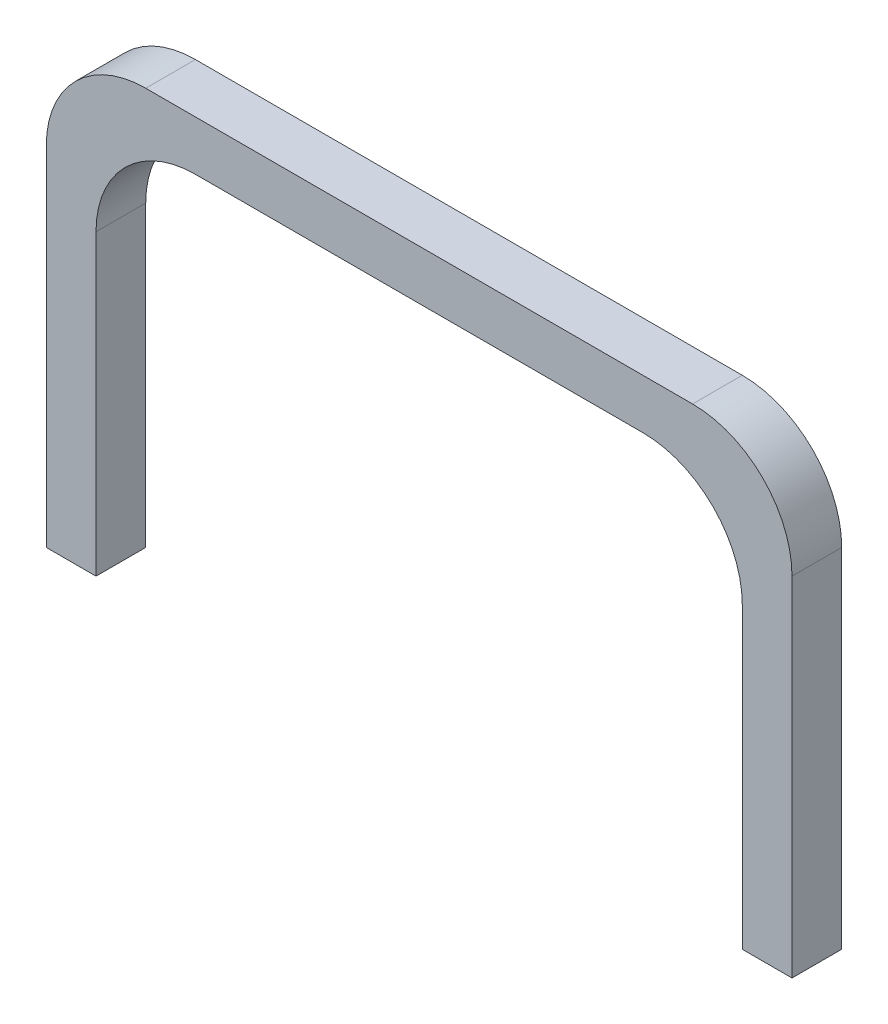
ISO-10303-21;
HEADER;
FILE_DESCRIPTION(('STEP AP214'),'2;1');
FILE_NAME('part.step','',(''),(''),'','','');
FILE_SCHEMA(('AUTOMOTIVE_DESIGN { 1 0 10303 214 1 1 1 1 }'));
ENDSEC;
DATA;
#1=APPLICATION_CONTEXT('core data for automotive mechanical design processes');
#2=APPLICATION_PROTOCOL_DEFINITION('international standard','automotive_design',2000,#1);
#3=PRODUCT_CONTEXT('',#1,'mechanical');
#4=PRODUCT('Part','Part','',(#3));
#5=PRODUCT_RELATED_PRODUCT_CATEGORY('part','',(#4));
#6=PRODUCT_DEFINITION_FORMATION('','',#4);
#7=PRODUCT_DEFINITION_CONTEXT('part definition',#1,'design');
#8=PRODUCT_DEFINITION('design','',#6,#7);
#9=PRODUCT_DEFINITION_SHAPE('','',#8);
#10=(LENGTH_UNIT() NAMED_UNIT(*) SI_UNIT(.MILLI.,.METRE.));
#11=(NAMED_UNIT(*) PLANE_ANGLE_UNIT() SI_UNIT($,.RADIAN.));
#12=(NAMED_UNIT(*) SI_UNIT($,.STERADIAN.) SOLID_ANGLE_UNIT());
#13=UNCERTAINTY_MEASURE_WITH_UNIT(LENGTH_MEASURE(1.E-05),#10,'distance_accuracy_value','');
#14=(GEOMETRIC_REPRESENTATION_CONTEXT(3) GLOBAL_UNCERTAINTY_ASSIGNED_CONTEXT((#13)) GLOBAL_UNIT_ASSIGNED_CONTEXT((#10,
#11,#12)) REPRESENTATION_CONTEXT('',''));
#15=CARTESIAN_POINT('',(0.,0.,0.));
#16=DIRECTION('',(0.,0.,1.));
#17=DIRECTION('',(1.,0.,0.));
#18=AXIS2_PLACEMENT_3D('',#15,#16,#17);
#19=CARTESIAN_POINT('',(0.,-0.5,0.));
#20=DIRECTION('',(0.,1.,0.));
#21=DIRECTION('',(0.,0.,1.));
#22=AXIS2_PLACEMENT_3D('',#19,#20,#21);
#23=PLANE('',#22);
#24=DIRECTION('',(-1.,0.,0.));
#25=VECTOR('',#24,1.);
#26=CARTESIAN_POINT('',(-7.5,-0.5,-0.5));
#27=LINE('',#26,#25);
#28=CARTESIAN_POINT('',(4.5,-0.5,-0.5));
#29=VERTEX_POINT('',#28);
#30=CARTESIAN_POINT('',(-4.5,-0.5,-0.5));
#31=VERTEX_POINT('',#30);
#32=EDGE_CURVE('E167',#29,#31,#27,.T.);
#33=ORIENTED_EDGE('',*,*,#32,.F.);
#34=DIRECTION('',(0.,0.,-1.));
#35=VECTOR('',#34,1.);
#36=CARTESIAN_POINT('',(4.5,-0.5,0.500000000000002));
#37=LINE('',#36,#35);
#38=CARTESIAN_POINT('',(4.5,-0.5,0.5));
#39=VERTEX_POINT('',#38);
#40=EDGE_CURVE('E58',#29,#39,#37,.F.);
#41=ORIENTED_EDGE('',*,*,#40,.T.);
#42=DIRECTION('',(1.,0.,0.));
#43=VECTOR('',#42,1.);
#44=CARTESIAN_POINT('',(-7.5,-0.5,0.5));
#45=LINE('',#44,#43);
#46=CARTESIAN_POINT('',(-4.5,-0.5,0.5));
#47=VERTEX_POINT('',#46);
#48=EDGE_CURVE('E172',#47,#39,#45,.T.);
#49=ORIENTED_EDGE('',*,*,#48,.F.);
#50=DIRECTION('',(0.,0.,1.));
#51=VECTOR('',#50,1.);
#52=CARTESIAN_POINT('',(-4.5,-0.5,-0.5));
#53=LINE('',#52,#51);
#54=EDGE_CURVE('E206',#47,#31,#53,.F.);
#55=ORIENTED_EDGE('',*,*,#54,.T.);
#56=EDGE_LOOP('',(#33,#41,#49,#55));
#57=FACE_BOUND('',#56,.T.);
#58=ADVANCED_FACE('F35',(#57),#23,.F.);
#59=CARTESIAN_POINT('',(7.5,0.5,-0.5));
#60=DIRECTION('',(-1.,0.,0.));
#61=DIRECTION('',(0.,0.,1.));
#62=AXIS2_PLACEMENT_3D('',#59,#60,#61);
#63=PLANE('',#62);
#64=DIRECTION('',(0.,-1.,0.));
#65=VECTOR('',#64,1.);
#66=CARTESIAN_POINT('',(7.5,0.5,-0.5));
#67=LINE('',#66,#65);
#68=CARTESIAN_POINT('',(7.5,-1.5,-0.5));
#69=VERTEX_POINT('',#68);
#70=CARTESIAN_POINT('',(7.5,-8.5,-0.499999999999998));
#71=VERTEX_POINT('',#70);
#72=EDGE_CURVE('E184',#69,#71,#67,.T.);
#73=ORIENTED_EDGE('',*,*,#72,.F.);
#74=DIRECTION('',(0.,0.,-1.));
#75=VECTOR('',#74,1.);
#76=CARTESIAN_POINT('',(7.5,-1.5,0.5));
#77=LINE('',#76,#75);
#78=CARTESIAN_POINT('',(7.5,-1.5,0.5));
#79=VERTEX_POINT('',#78);
#80=EDGE_CURVE('E196',#69,#79,#77,.F.);
#81=ORIENTED_EDGE('',*,*,#80,.T.);
#82=DIRECTION('',(0.,-1.,0.));
#83=VECTOR('',#82,1.);
#84=CARTESIAN_POINT('',(7.5,0.5,0.5));
#85=LINE('',#84,#83);
#86=CARTESIAN_POINT('',(7.5,-8.5,0.500000000000002));
#87=VERTEX_POINT('',#86);
#88=EDGE_CURVE('E175',#79,#87,#85,.T.);
#89=ORIENTED_EDGE('',*,*,#88,.T.);
#90=DIRECTION('',(0.,0.,1.));
#91=VECTOR('',#90,1.);
#92=CARTESIAN_POINT('',(7.5,-8.5,0.500000000000002));
#93=LINE('',#92,#91);
#94=EDGE_CURVE('E143',#71,#87,#93,.T.);
#95=ORIENTED_EDGE('',*,*,#94,.F.);
#96=EDGE_LOOP('',(#73,#81,#89,#95));
#97=FACE_BOUND('',#96,.T.);
#98=ADVANCED_FACE('F249',(#97),#63,.F.);
#99=CARTESIAN_POINT('',(-7.5,0.5,-0.5));
#100=DIRECTION('',(0.,0.,1.));
#101=DIRECTION('',(1.,0.,0.));
#102=AXIS2_PLACEMENT_3D('',#99,#100,#101);
#103=PLANE('',#102);
#104=DIRECTION('',(-1.,0.,0.));
#105=VECTOR('',#104,1.);
#106=CARTESIAN_POINT('',(-7.5,0.5,-0.5));
#107=LINE('',#106,#105);
#108=CARTESIAN_POINT('',(5.5,0.5,-0.5));
#109=VERTEX_POINT('',#108);
#110=CARTESIAN_POINT('',(-5.5,0.5,-0.5));
#111=VERTEX_POINT('',#110);
#112=EDGE_CURVE('E168',#109,#111,#107,.T.);
#113=ORIENTED_EDGE('',*,*,#112,.F.);
#114=CARTESIAN_POINT('',(5.5,-1.5,-0.5));
#115=DIRECTION('',(0.,0.,1.));
#116=DIRECTION('',(1.,0.,0.));
#117=AXIS2_PLACEMENT_3D('',#114,#115,#116);
#118=CIRCLE('',#117,2.);
#119=EDGE_CURVE('E194',#109,#69,#118,.F.);
#120=ORIENTED_EDGE('',*,*,#119,.T.);
#121=ORIENTED_EDGE('',*,*,#72,.T.);
#122=DIRECTION('',(1.,0.,0.));
#123=VECTOR('',#122,1.);
#124=CARTESIAN_POINT('',(7.5,-8.5,-0.499999999999998));
#125=LINE('',#124,#123);
#126=CARTESIAN_POINT('',(6.5,-8.5,-0.499999999999998));
#127=VERTEX_POINT('',#126);
#128=EDGE_CURVE('E136',#127,#71,#125,.T.);
#129=ORIENTED_EDGE('',*,*,#128,.F.);
#130=DIRECTION('',(0.,1.,0.));
#131=VECTOR('',#130,1.);
#132=CARTESIAN_POINT('',(6.5,-8.5,-0.499999999999998));
#133=LINE('',#132,#131);
#134=CARTESIAN_POINT('',(6.5,-2.5,-0.499999999999998));
#135=VERTEX_POINT('',#134);
#136=EDGE_CURVE('E132',#127,#135,#133,.T.);
#137=ORIENTED_EDGE('',*,*,#136,.T.);
#138=CARTESIAN_POINT('',(4.5,-2.5,-0.5));
#139=DIRECTION('',(0.,0.,1.));
#140=DIRECTION('',(1.,0.,0.));
#141=AXIS2_PLACEMENT_3D('',#138,#139,#140);
#142=CIRCLE('',#141,2.);
#143=EDGE_CURVE('E212',#135,#29,#142,.T.);
#144=ORIENTED_EDGE('',*,*,#143,.T.);
#145=ORIENTED_EDGE('',*,*,#32,.T.);
#146=CARTESIAN_POINT('',(-4.5,-2.5,-0.5));
#147=DIRECTION('',(0.,0.,1.));
#148=DIRECTION('',(1.,0.,0.));
#149=AXIS2_PLACEMENT_3D('',#146,#147,#148);
#150=CIRCLE('',#149,2.);
#151=CARTESIAN_POINT('',(-6.5,-2.5,-0.5));
#152=VERTEX_POINT('',#151);
#153=EDGE_CURVE('E11',#31,#152,#150,.T.);
#154=ORIENTED_EDGE('',*,*,#153,.T.);
#155=DIRECTION('',(0.,1.,0.));
#156=VECTOR('',#155,1.);
#157=CARTESIAN_POINT('',(-6.5,-8.5,-0.5));
#158=LINE('',#157,#156);
#159=CARTESIAN_POINT('',(-6.5,-8.5,-0.5));
#160=VERTEX_POINT('',#159);
#161=EDGE_CURVE('E164',#160,#152,#158,.T.);
#162=ORIENTED_EDGE('',*,*,#161,.F.);
#163=DIRECTION('',(1.,0.,0.));
#164=VECTOR('',#163,1.);
#165=CARTESIAN_POINT('',(-7.5,-8.5,-0.5));
#166=LINE('',#165,#164);
#167=CARTESIAN_POINT('',(-7.5,-8.5,-0.5));
#168=VERTEX_POINT('',#167);
#169=EDGE_CURVE('E150',#168,#160,#166,.T.);
#170=ORIENTED_EDGE('',*,*,#169,.F.);
#171=DIRECTION('',(0.,-1.,0.));
#172=VECTOR('',#171,1.);
#173=CARTESIAN_POINT('',(-7.5,0.5,-0.5));
#174=LINE('',#173,#172);
#175=CARTESIAN_POINT('',(-7.5,-1.5,-0.5));
#176=VERTEX_POINT('',#175);
#177=EDGE_CURVE('E182',#176,#168,#174,.T.);
#178=ORIENTED_EDGE('',*,*,#177,.F.);
#179=CARTESIAN_POINT('',(-5.5,-1.5,-0.5));
#180=DIRECTION('',(0.,0.,1.));
#181=DIRECTION('',(1.,0.,0.));
#182=AXIS2_PLACEMENT_3D('',#179,#180,#181);
#183=CIRCLE('',#182,2.);
#184=EDGE_CURVE('E192',#176,#111,#183,.F.);
#185=ORIENTED_EDGE('',*,*,#184,.T.);
#186=EDGE_LOOP('',(#113,#120,#121,#129,#137,#144,#145,#154,#162,#170,#178,#185));
#187=FACE_BOUND('',#186,.T.);
#188=ADVANCED_FACE('F223',(#187),#103,.F.);
#189=CARTESIAN_POINT('',(-7.5,0.5,-0.5));
#190=DIRECTION('',(1.,0.,0.));
#191=DIRECTION('',(0.,0.,-1.));
#192=AXIS2_PLACEMENT_3D('',#189,#190,#191);
#193=PLANE('',#192);
#194=DIRECTION('',(0.,-1.,0.));
#195=VECTOR('',#194,1.);
#196=CARTESIAN_POINT('',(-7.5,0.5,0.5));
#197=LINE('',#196,#195);
#198=CARTESIAN_POINT('',(-7.5,-1.5,0.5));
#199=VERTEX_POINT('',#198);
#200=CARTESIAN_POINT('',(-7.5,-8.5,0.5));
#201=VERTEX_POINT('',#200);
#202=EDGE_CURVE('E180',#199,#201,#197,.T.);
#203=ORIENTED_EDGE('',*,*,#202,.F.);
#204=DIRECTION('',(0.,0.,1.));
#205=VECTOR('',#204,1.);
#206=CARTESIAN_POINT('',(-7.5,-1.5,-0.5));
#207=LINE('',#206,#205);
#208=EDGE_CURVE('E202',#199,#176,#207,.F.);
#209=ORIENTED_EDGE('',*,*,#208,.T.);
#210=ORIENTED_EDGE('',*,*,#177,.T.);
#211=DIRECTION('',(0.,0.,-1.));
#212=VECTOR('',#211,1.);
#213=CARTESIAN_POINT('',(-7.5,-8.5,0.5));
#214=LINE('',#213,#212);
#215=EDGE_CURVE('E147',#201,#168,#214,.T.);
#216=ORIENTED_EDGE('',*,*,#215,.F.);
#217=EDGE_LOOP('',(#203,#209,#210,#216));
#218=FACE_BOUND('',#217,.T.);
#219=ADVANCED_FACE('F270',(#218),#193,.F.);
#220=CARTESIAN_POINT('',(-7.5,0.5,0.5));
#221=DIRECTION('',(0.,0.,-1.));
#222=DIRECTION('',(-1.,0.,0.));
#223=AXIS2_PLACEMENT_3D('',#220,#221,#222);
#224=PLANE('',#223);
#225=ORIENTED_EDGE('',*,*,#88,.F.);
#226=CARTESIAN_POINT('',(5.5,-1.5,0.5));
#227=DIRECTION('',(0.,0.,-1.));
#228=DIRECTION('',(-1.,0.,0.));
#229=AXIS2_PLACEMENT_3D('',#226,#227,#228);
#230=CIRCLE('',#229,2.);
#231=CARTESIAN_POINT('',(5.5,0.5,0.5));
#232=VERTEX_POINT('',#231);
#233=EDGE_CURVE('E200',#79,#232,#230,.F.);
#234=ORIENTED_EDGE('',*,*,#233,.T.);
#235=DIRECTION('',(1.,0.,0.));
#236=VECTOR('',#235,1.);
#237=CARTESIAN_POINT('',(-7.5,0.5,0.5));
#238=LINE('',#237,#236);
#239=CARTESIAN_POINT('',(-5.5,0.5,0.5));
#240=VERTEX_POINT('',#239);
#241=EDGE_CURVE('E171',#240,#232,#238,.T.);
#242=ORIENTED_EDGE('',*,*,#241,.F.);
#243=CARTESIAN_POINT('',(-5.5,-1.5,0.5));
#244=DIRECTION('',(0.,0.,-1.));
#245=DIRECTION('',(-1.,0.,0.));
#246=AXIS2_PLACEMENT_3D('',#243,#244,#245);
#247=CIRCLE('',#246,2.);
#248=EDGE_CURVE('E198',#240,#199,#247,.F.);
#249=ORIENTED_EDGE('',*,*,#248,.T.);
#250=ORIENTED_EDGE('',*,*,#202,.T.);
#251=DIRECTION('',(-1.,0.,0.));
#252=VECTOR('',#251,1.);
#253=CARTESIAN_POINT('',(-7.5,-8.5,0.5));
#254=LINE('',#253,#252);
#255=CARTESIAN_POINT('',(-6.5,-8.5,0.5));
#256=VERTEX_POINT('',#255);
#257=EDGE_CURVE('E158',#256,#201,#254,.T.);
#258=ORIENTED_EDGE('',*,*,#257,.F.);
#259=DIRECTION('',(0.,1.,0.));
#260=VECTOR('',#259,1.);
#261=CARTESIAN_POINT('',(-6.5,-8.5,0.5));
#262=LINE('',#261,#260);
#263=CARTESIAN_POINT('',(-6.5,-2.5,0.5));
#264=VERTEX_POINT('',#263);
#265=EDGE_CURVE('E161',#256,#264,#262,.T.);
#266=ORIENTED_EDGE('',*,*,#265,.T.);
#267=CARTESIAN_POINT('',(-4.5,-2.5,0.5));
#268=DIRECTION('',(0.,0.,-1.));
#269=DIRECTION('',(-1.,0.,0.));
#270=AXIS2_PLACEMENT_3D('',#267,#268,#269);
#271=CIRCLE('',#270,2.);
#272=EDGE_CURVE('E43',#264,#47,#271,.T.);
#273=ORIENTED_EDGE('',*,*,#272,.T.);
#274=ORIENTED_EDGE('',*,*,#48,.T.);
#275=CARTESIAN_POINT('',(4.5,-2.5,0.5));
#276=DIRECTION('',(0.,0.,-1.));
#277=DIRECTION('',(-1.,0.,0.));
#278=AXIS2_PLACEMENT_3D('',#275,#276,#277);
#279=CIRCLE('',#278,2.);
#280=CARTESIAN_POINT('',(6.5,-2.5,0.500000000000002));
#281=VERTEX_POINT('',#280);
#282=EDGE_CURVE('E50',#39,#281,#279,.T.);
#283=ORIENTED_EDGE('',*,*,#282,.T.);
#284=DIRECTION('',(0.,1.,0.));
#285=VECTOR('',#284,1.);
#286=CARTESIAN_POINT('',(6.5,-8.5,0.500000000000002));
#287=LINE('',#286,#285);
#288=CARTESIAN_POINT('',(6.5,-8.5,0.500000000000002));
#289=VERTEX_POINT('',#288);
#290=EDGE_CURVE('E129',#289,#281,#287,.T.);
#291=ORIENTED_EDGE('',*,*,#290,.F.);
#292=DIRECTION('',(-1.,0.,0.));
#293=VECTOR('',#292,1.);
#294=CARTESIAN_POINT('',(7.5,-8.5,0.500000000000002));
#295=LINE('',#294,#293);
#296=EDGE_CURVE('E137',#87,#289,#295,.T.);
#297=ORIENTED_EDGE('',*,*,#296,.F.);
#298=EDGE_LOOP('',(#225,#234,#242,#249,#250,#258,#266,#273,#274,#283,#291,#297));
#299=FACE_BOUND('',#298,.T.);
#300=ADVANCED_FACE('F146',(#299),#224,.F.);
#301=CARTESIAN_POINT('',(0.,0.5,0.));
#302=DIRECTION('',(0.,1.,0.));
#303=DIRECTION('',(0.,0.,1.));
#304=AXIS2_PLACEMENT_3D('',#301,#302,#303);
#305=PLANE('',#304);
#306=ORIENTED_EDGE('',*,*,#241,.T.);
#307=DIRECTION('',(0.,0.,-1.));
#308=VECTOR('',#307,1.);
#309=CARTESIAN_POINT('',(5.5,0.5,-0.5));
#310=LINE('',#309,#308);
#311=EDGE_CURVE('E189',#232,#109,#310,.T.);
#312=ORIENTED_EDGE('',*,*,#311,.T.);
#313=ORIENTED_EDGE('',*,*,#112,.T.);
#314=DIRECTION('',(0.,0.,1.));
#315=VECTOR('',#314,1.);
#316=CARTESIAN_POINT('',(-5.5,0.5,0.5));
#317=LINE('',#316,#315);
#318=EDGE_CURVE('E186',#111,#240,#317,.T.);
#319=ORIENTED_EDGE('',*,*,#318,.T.);
#320=EDGE_LOOP('',(#306,#312,#313,#319));
#321=FACE_BOUND('',#320,.T.);
#322=ADVANCED_FACE('F240',(#321),#305,.T.);
#323=CARTESIAN_POINT('',(-6.5,-8.5,0.5));
#324=DIRECTION('',(-1.,0.,0.));
#325=DIRECTION('',(0.,0.,1.));
#326=AXIS2_PLACEMENT_3D('',#323,#324,#325);
#327=PLANE('',#326);
#328=ORIENTED_EDGE('',*,*,#161,.T.);
#329=DIRECTION('',(0.,0.,1.));
#330=VECTOR('',#329,1.);
#331=CARTESIAN_POINT('',(-6.5,-2.5,0.5));
#332=LINE('',#331,#330);
#333=EDGE_CURVE('E209',#152,#264,#332,.T.);
#334=ORIENTED_EDGE('',*,*,#333,.T.);
#335=ORIENTED_EDGE('',*,*,#265,.F.);
#336=DIRECTION('',(0.,0.,1.));
#337=VECTOR('',#336,1.);
#338=CARTESIAN_POINT('',(-6.5,-8.5,0.5));
#339=LINE('',#338,#337);
#340=EDGE_CURVE('E156',#160,#256,#339,.T.);
#341=ORIENTED_EDGE('',*,*,#340,.F.);
#342=EDGE_LOOP('',(#328,#334,#335,#341));
#343=FACE_BOUND('',#342,.T.);
#344=ADVANCED_FACE('F227',(#343),#327,.F.);
#345=CARTESIAN_POINT('',(0.,-8.5,0.));
#346=DIRECTION('',(0.,-1.,0.));
#347=DIRECTION('',(0.,0.,-1.));
#348=AXIS2_PLACEMENT_3D('',#345,#346,#347);
#349=PLANE('',#348);
#350=ORIENTED_EDGE('',*,*,#215,.T.);
#351=ORIENTED_EDGE('',*,*,#169,.T.);
#352=ORIENTED_EDGE('',*,*,#340,.T.);
#353=ORIENTED_EDGE('',*,*,#257,.T.);
#354=EDGE_LOOP('',(#350,#351,#352,#353));
#355=FACE_BOUND('',#354,.T.);
#356=ADVANCED_FACE('F229',(#355),#349,.T.);
#357=CARTESIAN_POINT('',(6.5,-8.5,0.500000000000002));
#358=DIRECTION('',(1.,0.,0.));
#359=DIRECTION('',(0.,0.,-1.));
#360=AXIS2_PLACEMENT_3D('',#357,#358,#359);
#361=PLANE('',#360);
#362=ORIENTED_EDGE('',*,*,#290,.T.);
#363=DIRECTION('',(0.,0.,-1.));
#364=VECTOR('',#363,1.);
#365=CARTESIAN_POINT('',(6.5,-2.5,-0.499999999999998));
#366=LINE('',#365,#364);
#367=EDGE_CURVE('E204',#281,#135,#366,.T.);
#368=ORIENTED_EDGE('',*,*,#367,.T.);
#369=ORIENTED_EDGE('',*,*,#136,.F.);
#370=DIRECTION('',(0.,0.,-1.));
#371=VECTOR('',#370,1.);
#372=CARTESIAN_POINT('',(6.5,-8.5,0.500000000000002));
#373=LINE('',#372,#371);
#374=EDGE_CURVE('E125',#289,#127,#373,.T.);
#375=ORIENTED_EDGE('',*,*,#374,.F.);
#376=EDGE_LOOP('',(#362,#368,#369,#375));
#377=FACE_BOUND('',#376,.T.);
#378=ADVANCED_FACE('F127',(#377),#361,.F.);
#379=CARTESIAN_POINT('',(0.,-8.5,0.));
#380=DIRECTION('',(0.,-1.,0.));
#381=DIRECTION('',(0.,0.,-1.));
#382=AXIS2_PLACEMENT_3D('',#379,#380,#381);
#383=PLANE('',#382);
#384=ORIENTED_EDGE('',*,*,#296,.T.);
#385=ORIENTED_EDGE('',*,*,#374,.T.);
#386=ORIENTED_EDGE('',*,*,#128,.T.);
#387=ORIENTED_EDGE('',*,*,#94,.T.);
#388=EDGE_LOOP('',(#384,#385,#386,#387));
#389=FACE_BOUND('',#388,.T.);
#390=ADVANCED_FACE('F141',(#389),#383,.T.);
#391=CARTESIAN_POINT('',(5.5,-1.5,0.));
#392=DIRECTION('',(0.,0.,1.));
#393=DIRECTION('',(1.,0.,0.));
#394=AXIS2_PLACEMENT_3D('',#391,#392,#393);
#395=CYLINDRICAL_SURFACE('',#394,2.);
#396=ORIENTED_EDGE('',*,*,#233,.F.);
#397=ORIENTED_EDGE('',*,*,#80,.F.);
#398=ORIENTED_EDGE('',*,*,#119,.F.);
#399=ORIENTED_EDGE('',*,*,#311,.F.);
#400=EDGE_LOOP('',(#396,#397,#398,#399));
#401=FACE_BOUND('',#400,.T.);
#402=ADVANCED_FACE('F246',(#401),#395,.T.);
#403=CARTESIAN_POINT('',(-5.5,-1.5,0.));
#404=DIRECTION('',(0.,0.,-1.));
#405=DIRECTION('',(-1.,0.,0.));
#406=AXIS2_PLACEMENT_3D('',#403,#404,#405);
#407=CYLINDRICAL_SURFACE('',#406,2.);
#408=ORIENTED_EDGE('',*,*,#184,.F.);
#409=ORIENTED_EDGE('',*,*,#208,.F.);
#410=ORIENTED_EDGE('',*,*,#248,.F.);
#411=ORIENTED_EDGE('',*,*,#318,.F.);
#412=EDGE_LOOP('',(#408,#409,#410,#411));
#413=FACE_BOUND('',#412,.T.);
#414=ADVANCED_FACE('F237',(#413),#407,.T.);
#415=CARTESIAN_POINT('',(4.5,-2.5,0.500000000000002));
#416=DIRECTION('',(0.,0.,1.));
#417=DIRECTION('',(1.,0.,0.));
#418=AXIS2_PLACEMENT_3D('',#415,#416,#417);
#419=CYLINDRICAL_SURFACE('',#418,2.);
#420=ORIENTED_EDGE('',*,*,#282,.F.);
#421=ORIENTED_EDGE('',*,*,#40,.F.);
#422=ORIENTED_EDGE('',*,*,#143,.F.);
#423=ORIENTED_EDGE('',*,*,#367,.F.);
#424=EDGE_LOOP('',(#420,#421,#422,#423));
#425=FACE_BOUND('',#424,.T.);
#426=ADVANCED_FACE('F252',(#425),#419,.F.);
#427=CARTESIAN_POINT('',(-4.5,-2.5,0.5));
#428=DIRECTION('',(0.,0.,-1.));
#429=DIRECTION('',(-1.,0.,0.));
#430=AXIS2_PLACEMENT_3D('',#427,#428,#429);
#431=CYLINDRICAL_SURFACE('',#430,2.);
#432=ORIENTED_EDGE('',*,*,#153,.F.);
#433=ORIENTED_EDGE('',*,*,#54,.F.);
#434=ORIENTED_EDGE('',*,*,#272,.F.);
#435=ORIENTED_EDGE('',*,*,#333,.F.);
#436=EDGE_LOOP('',(#432,#433,#434,#435));
#437=FACE_BOUND('',#436,.T.);
#438=ADVANCED_FACE('F37',(#437),#431,.F.);
#439=CLOSED_SHELL('',(#58,#98,#188,#219,#300,#322,#344,#356,#378,#390,#402,#414,#426,#438));
#440=MANIFOLD_SOLID_BREP('B2',#439);
#441=ADVANCED_BREP_SHAPE_REPRESENTATION('',(#18,#440),#14);
#442=SHAPE_DEFINITION_REPRESENTATION(#9,#441);
ENDSEC;
END-ISO-10303-21;
